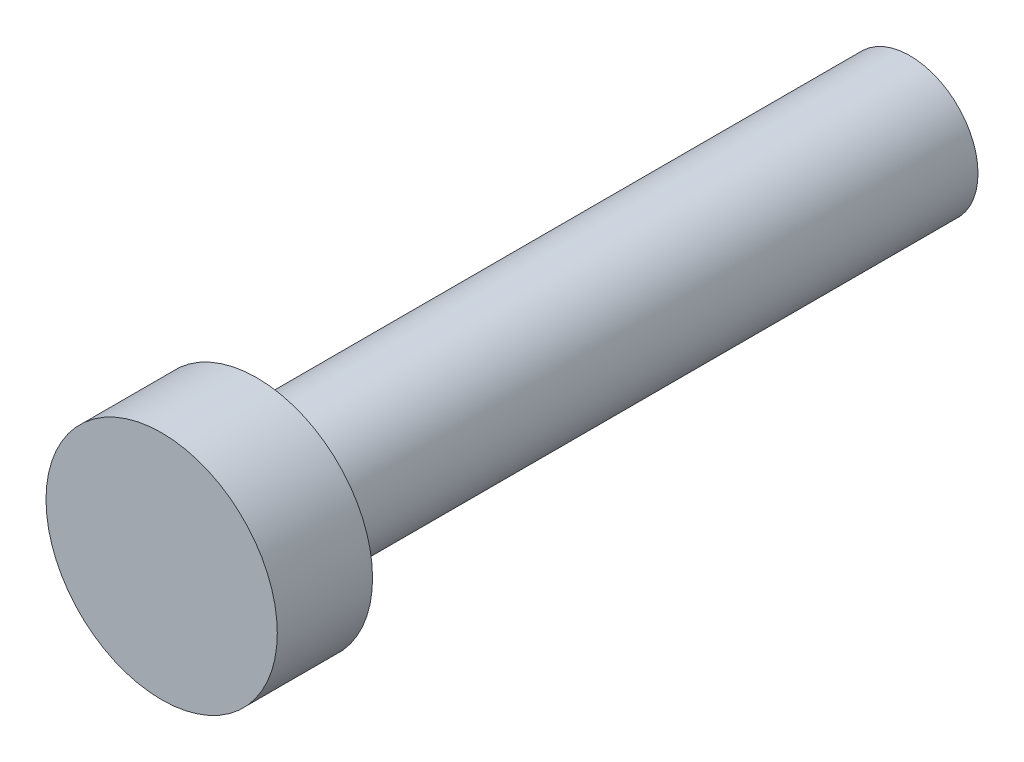
ISO-10303-21;
HEADER;
FILE_DESCRIPTION(('STEP AP214'),'2;1');
FILE_NAME('part.step','',(''),(''),'','','');
FILE_SCHEMA(('AUTOMOTIVE_DESIGN { 1 0 10303 214 1 1 1 1 }'));
ENDSEC;
DATA;
#1=APPLICATION_CONTEXT('core data for automotive mechanical design processes');
#2=APPLICATION_PROTOCOL_DEFINITION('international standard','automotive_design',2000,#1);
#3=PRODUCT_CONTEXT('',#1,'mechanical');
#4=PRODUCT('Part','Part','',(#3));
#5=PRODUCT_RELATED_PRODUCT_CATEGORY('part','',(#4));
#6=PRODUCT_DEFINITION_FORMATION('','',#4);
#7=PRODUCT_DEFINITION_CONTEXT('part definition',#1,'design');
#8=PRODUCT_DEFINITION('design','',#6,#7);
#9=PRODUCT_DEFINITION_SHAPE('','',#8);
#10=(LENGTH_UNIT() NAMED_UNIT(*) SI_UNIT(.MILLI.,.METRE.));
#11=(NAMED_UNIT(*) PLANE_ANGLE_UNIT() SI_UNIT($,.RADIAN.));
#12=(NAMED_UNIT(*) SI_UNIT($,.STERADIAN.) SOLID_ANGLE_UNIT());
#13=UNCERTAINTY_MEASURE_WITH_UNIT(LENGTH_MEASURE(1.E-05),#10,'distance_accuracy_value','');
#14=(GEOMETRIC_REPRESENTATION_CONTEXT(3) GLOBAL_UNCERTAINTY_ASSIGNED_CONTEXT((#13)) GLOBAL_UNIT_ASSIGNED_CONTEXT((#10,
#11,#12)) REPRESENTATION_CONTEXT('',''));
#15=CARTESIAN_POINT('',(0.,0.,0.));
#16=DIRECTION('',(0.,0.,1.));
#17=DIRECTION('',(1.,0.,0.));
#18=AXIS2_PLACEMENT_3D('',#15,#16,#17);
#19=CARTESIAN_POINT('',(300.,40.,362.5));
#20=DIRECTION('',(0.,0.,-1.));
#21=DIRECTION('',(-1.,0.,0.));
#22=AXIS2_PLACEMENT_3D('',#19,#20,#21);
#23=CYLINDRICAL_SURFACE('',#22,2.5);
#24=CARTESIAN_POINT('',(300.,40.,362.5));
#25=DIRECTION('',(0.,0.,1.));
#26=DIRECTION('',(1.,0.,0.));
#27=AXIS2_PLACEMENT_3D('',#24,#25,#26);
#28=CIRCLE('',#27,2.5);
#29=CARTESIAN_POINT('',(302.5,40.,362.5));
#30=VERTEX_POINT('',#29);
#31=EDGE_CURVE('E10',#30,#30,#28,.T.);
#32=ORIENTED_EDGE('',*,*,#31,.F.);
#33=EDGE_LOOP('',(#32));
#34=FACE_BOUND('',#33,.T.);
#35=CARTESIAN_POINT('',(300.,40.,338.5));
#36=DIRECTION('',(0.,0.,1.));
#37=DIRECTION('',(1.,0.,0.));
#38=AXIS2_PLACEMENT_3D('',#35,#36,#37);
#39=CIRCLE('',#38,2.5);
#40=CARTESIAN_POINT('',(302.5,40.,338.5));
#41=VERTEX_POINT('',#40);
#42=EDGE_CURVE('E40',#41,#41,#39,.T.);
#43=ORIENTED_EDGE('',*,*,#42,.T.);
#44=EDGE_LOOP('',(#43));
#45=FACE_BOUND('',#44,.T.);
#46=ADVANCED_FACE('F37',(#34,#45),#23,.T.);
#47=CARTESIAN_POINT('',(300.,40.,338.5));
#48=DIRECTION('',(0.,0.,1.));
#49=DIRECTION('',(1.,0.,0.));
#50=AXIS2_PLACEMENT_3D('',#47,#48,#49);
#51=PLANE('',#50);
#52=ORIENTED_EDGE('',*,*,#42,.F.);
#53=EDGE_LOOP('',(#52));
#54=FACE_BOUND('',#53,.T.);
#55=ADVANCED_FACE('F60',(#54),#51,.F.);
#56=CARTESIAN_POINT('',(300.,40.,366.));
#57=DIRECTION('',(0.,0.,-1.));
#58=DIRECTION('',(-1.,0.,0.));
#59=AXIS2_PLACEMENT_3D('',#56,#57,#58);
#60=CYLINDRICAL_SURFACE('',#59,4.24999999999998);
#61=CARTESIAN_POINT('',(300.,40.,366.));
#62=DIRECTION('',(0.,0.,1.));
#63=DIRECTION('',(1.,0.,0.));
#64=AXIS2_PLACEMENT_3D('',#61,#62,#63);
#65=CIRCLE('',#64,4.24999999999998);
#66=CARTESIAN_POINT('',(304.25,40.,366.));
#67=VERTEX_POINT('',#66);
#68=EDGE_CURVE('E47',#67,#67,#65,.T.);
#69=ORIENTED_EDGE('',*,*,#68,.F.);
#70=EDGE_LOOP('',(#69));
#71=FACE_BOUND('',#70,.T.);
#72=CARTESIAN_POINT('',(300.,40.,362.5));
#73=DIRECTION('',(0.,0.,1.));
#74=DIRECTION('',(1.,0.,0.));
#75=AXIS2_PLACEMENT_3D('',#72,#73,#74);
#76=CIRCLE('',#75,4.24999999999998);
#77=CARTESIAN_POINT('',(304.25,40.,362.5));
#78=VERTEX_POINT('',#77);
#79=EDGE_CURVE('E49',#78,#78,#76,.T.);
#80=ORIENTED_EDGE('',*,*,#79,.T.);
#81=EDGE_LOOP('',(#80));
#82=FACE_BOUND('',#81,.T.);
#83=ADVANCED_FACE('F57',(#71,#82),#60,.T.);
#84=CARTESIAN_POINT('',(300.,40.,366.));
#85=DIRECTION('',(0.,0.,1.));
#86=DIRECTION('',(1.,0.,0.));
#87=AXIS2_PLACEMENT_3D('',#84,#85,#86);
#88=PLANE('',#87);
#89=ORIENTED_EDGE('',*,*,#68,.T.);
#90=EDGE_LOOP('',(#89));
#91=FACE_BOUND('',#90,.T.);
#92=ADVANCED_FACE('F55',(#91),#88,.T.);
#93=CARTESIAN_POINT('',(300.,40.,362.5));
#94=DIRECTION('',(0.,0.,1.));
#95=DIRECTION('',(1.,0.,0.));
#96=AXIS2_PLACEMENT_3D('',#93,#94,#95);
#97=PLANE('',#96);
#98=ORIENTED_EDGE('',*,*,#31,.T.);
#99=EDGE_LOOP('',(#98));
#100=FACE_BOUND('',#99,.T.);
#101=ORIENTED_EDGE('',*,*,#79,.F.);
#102=EDGE_LOOP('',(#101));
#103=FACE_BOUND('',#102,.T.);
#104=ADVANCED_FACE('F64',(#100,#103),#97,.F.);
#105=CLOSED_SHELL('',(#46,#55,#83,#92,#104));
#106=MANIFOLD_SOLID_BREP('B2',#105);
#107=ADVANCED_BREP_SHAPE_REPRESENTATION('',(#18,#106),#14);
#108=SHAPE_DEFINITION_REPRESENTATION(#9,#107);
ENDSEC;
END-ISO-10303-21;
